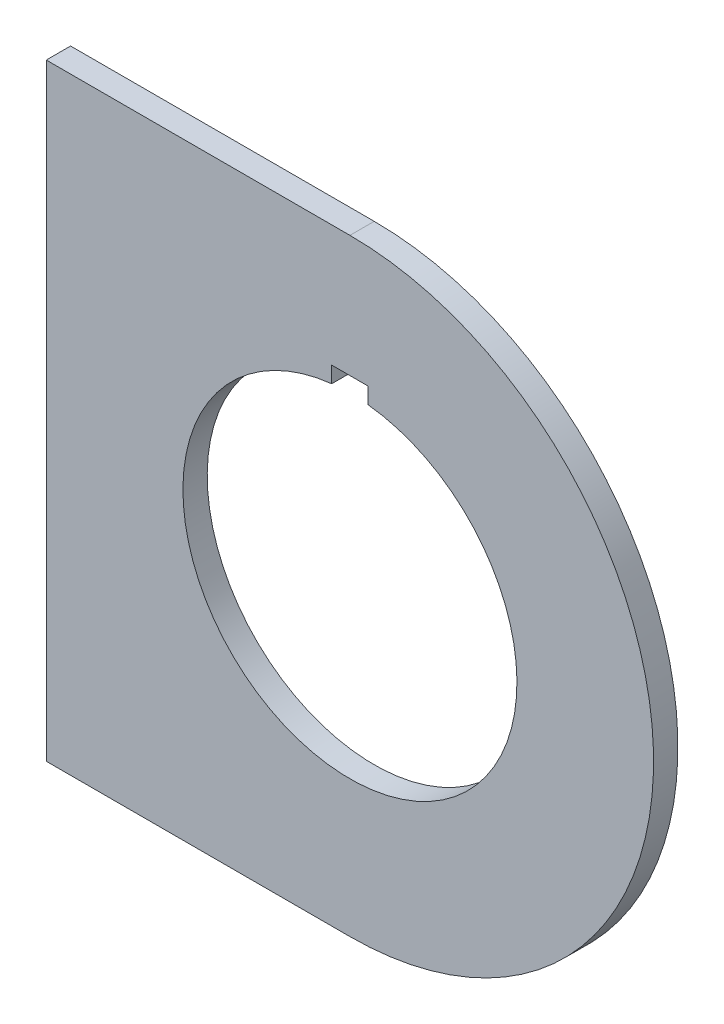
ISO-10303-21;
HEADER;
FILE_DESCRIPTION(('STEP AP214'),'2;1');
FILE_NAME('part.step','',(''),(''),'','','');
FILE_SCHEMA(('AUTOMOTIVE_DESIGN { 1 0 10303 214 1 1 1 1 }'));
ENDSEC;
DATA;
#1=APPLICATION_CONTEXT('core data for automotive mechanical design processes');
#2=APPLICATION_PROTOCOL_DEFINITION('international standard','automotive_design',2000,#1);
#3=PRODUCT_CONTEXT('',#1,'mechanical');
#4=PRODUCT('Part','Part','',(#3));
#5=PRODUCT_RELATED_PRODUCT_CATEGORY('part','',(#4));
#6=PRODUCT_DEFINITION_FORMATION('','',#4);
#7=PRODUCT_DEFINITION_CONTEXT('part definition',#1,'design');
#8=PRODUCT_DEFINITION('design','',#6,#7);
#9=PRODUCT_DEFINITION_SHAPE('','',#8);
#10=(LENGTH_UNIT() NAMED_UNIT(*) SI_UNIT(.MILLI.,.METRE.));
#11=(NAMED_UNIT(*) PLANE_ANGLE_UNIT() SI_UNIT($,.RADIAN.));
#12=(NAMED_UNIT(*) SI_UNIT($,.STERADIAN.) SOLID_ANGLE_UNIT());
#13=UNCERTAINTY_MEASURE_WITH_UNIT(LENGTH_MEASURE(1.E-05),#10,'distance_accuracy_value','');
#14=(GEOMETRIC_REPRESENTATION_CONTEXT(3) GLOBAL_UNCERTAINTY_ASSIGNED_CONTEXT((#13)) GLOBAL_UNIT_ASSIGNED_CONTEXT((#10,
#11,#12)) REPRESENTATION_CONTEXT('',''));
#15=CARTESIAN_POINT('',(0.,0.,0.));
#16=DIRECTION('',(0.,0.,1.));
#17=DIRECTION('',(1.,0.,0.));
#18=AXIS2_PLACEMENT_3D('',#15,#16,#17);
#19=CARTESIAN_POINT('',(25.,25.,2.));
#20=DIRECTION('',(0.,0.,1.));
#21=DIRECTION('',(1.,0.,0.));
#22=AXIS2_PLACEMENT_3D('',#19,#20,#21);
#23=PLANE('',#22);
#24=DIRECTION('',(0.,-1.,0.));
#25=VECTOR('',#24,1.);
#26=CARTESIAN_POINT('',(0.,0.,2.));
#27=LINE('',#26,#25);
#28=CARTESIAN_POINT('',(0.,50.,2.));
#29=VERTEX_POINT('',#28);
#30=CARTESIAN_POINT('',(0.,0.,2.));
#31=VERTEX_POINT('',#30);
#32=EDGE_CURVE('E136',#29,#31,#27,.T.);
#33=ORIENTED_EDGE('',*,*,#32,.T.);
#34=DIRECTION('',(1.,0.,0.));
#35=VECTOR('',#34,1.);
#36=CARTESIAN_POINT('',(0.,0.,2.));
#37=LINE('',#36,#35);
#38=CARTESIAN_POINT('',(25.,0.,2.));
#39=VERTEX_POINT('',#38);
#40=EDGE_CURVE('E139',#31,#39,#37,.T.);
#41=ORIENTED_EDGE('',*,*,#40,.T.);
#42=CARTESIAN_POINT('',(25.,25.,2.));
#43=DIRECTION('',(0.,0.,1.));
#44=DIRECTION('',(1.,0.,0.));
#45=AXIS2_PLACEMENT_3D('',#42,#43,#44);
#46=CIRCLE('',#45,25.);
#47=CARTESIAN_POINT('',(25.,50.,2.));
#48=VERTEX_POINT('',#47);
#49=EDGE_CURVE('E142',#39,#48,#46,.T.);
#50=ORIENTED_EDGE('',*,*,#49,.T.);
#51=DIRECTION('',(-1.,0.,0.));
#52=VECTOR('',#51,1.);
#53=CARTESIAN_POINT('',(0.,50.,2.));
#54=LINE('',#53,#52);
#55=EDGE_CURVE('E144',#48,#29,#54,.T.);
#56=ORIENTED_EDGE('',*,*,#55,.T.);
#57=EDGE_LOOP('',(#33,#41,#50,#56));
#58=FACE_BOUND('',#57,.T.);
#59=DIRECTION('',(0.,1.,0.));
#60=VECTOR('',#59,1.);
#61=CARTESIAN_POINT('',(26.5,40.,2.));
#62=LINE('',#61,#60);
#63=CARTESIAN_POINT('',(26.5,38.6679369328366,2.));
#64=VERTEX_POINT('',#63);
#65=CARTESIAN_POINT('',(26.5,40.,2.));
#66=VERTEX_POINT('',#65);
#67=EDGE_CURVE('E108',#64,#66,#62,.T.);
#68=ORIENTED_EDGE('',*,*,#67,.F.);
#69=CARTESIAN_POINT('',(25.,25.,2.));
#70=DIRECTION('',(0.,0.,1.));
#71=DIRECTION('',(1.,0.,0.));
#72=AXIS2_PLACEMENT_3D('',#69,#70,#71);
#73=CIRCLE('',#72,13.75);
#74=CARTESIAN_POINT('',(23.5,38.6679369328366,2.));
#75=VERTEX_POINT('',#74);
#76=EDGE_CURVE('E100',#75,#64,#73,.T.);
#77=ORIENTED_EDGE('',*,*,#76,.F.);
#78=DIRECTION('',(0.,-1.,0.));
#79=VECTOR('',#78,1.);
#80=CARTESIAN_POINT('',(23.5,40.,2.));
#81=LINE('',#80,#79);
#82=CARTESIAN_POINT('',(23.5,40.,2.));
#83=VERTEX_POINT('',#82);
#84=EDGE_CURVE('E122',#83,#75,#81,.T.);
#85=ORIENTED_EDGE('',*,*,#84,.F.);
#86=DIRECTION('',(-1.,0.,0.));
#87=VECTOR('',#86,1.);
#88=CARTESIAN_POINT('',(23.5,40.,2.));
#89=LINE('',#88,#87);
#90=EDGE_CURVE('E120',#66,#83,#89,.T.);
#91=ORIENTED_EDGE('',*,*,#90,.F.);
#92=EDGE_LOOP('',(#68,#77,#85,#91));
#93=FACE_BOUND('',#92,.T.);
#94=ADVANCED_FACE('F35',(#58,#93),#23,.T.);
#95=CARTESIAN_POINT('',(25.,25.,0.));
#96=DIRECTION('',(0.,0.,1.));
#97=DIRECTION('',(1.,0.,0.));
#98=AXIS2_PLACEMENT_3D('',#95,#96,#97);
#99=PLANE('',#98);
#100=DIRECTION('',(0.,-1.,0.));
#101=VECTOR('',#100,1.);
#102=CARTESIAN_POINT('',(0.,0.,0.));
#103=LINE('',#102,#101);
#104=CARTESIAN_POINT('',(0.,50.,0.));
#105=VERTEX_POINT('',#104);
#106=CARTESIAN_POINT('',(0.,0.,0.));
#107=VERTEX_POINT('',#106);
#108=EDGE_CURVE('E116',#105,#107,#103,.T.);
#109=ORIENTED_EDGE('',*,*,#108,.F.);
#110=DIRECTION('',(-1.,0.,0.));
#111=VECTOR('',#110,1.);
#112=CARTESIAN_POINT('',(0.,50.,0.));
#113=LINE('',#112,#111);
#114=CARTESIAN_POINT('',(25.,50.,0.));
#115=VERTEX_POINT('',#114);
#116=EDGE_CURVE('E140',#115,#105,#113,.T.);
#117=ORIENTED_EDGE('',*,*,#116,.F.);
#118=CARTESIAN_POINT('',(25.,25.,0.));
#119=DIRECTION('',(0.,0.,1.));
#120=DIRECTION('',(1.,0.,0.));
#121=AXIS2_PLACEMENT_3D('',#118,#119,#120);
#122=CIRCLE('',#121,25.);
#123=CARTESIAN_POINT('',(25.,0.,0.));
#124=VERTEX_POINT('',#123);
#125=EDGE_CURVE('E151',#124,#115,#122,.T.);
#126=ORIENTED_EDGE('',*,*,#125,.F.);
#127=DIRECTION('',(1.,0.,0.));
#128=VECTOR('',#127,1.);
#129=CARTESIAN_POINT('',(0.,0.,0.));
#130=LINE('',#129,#128);
#131=EDGE_CURVE('E149',#107,#124,#130,.T.);
#132=ORIENTED_EDGE('',*,*,#131,.F.);
#133=EDGE_LOOP('',(#109,#117,#126,#132));
#134=FACE_BOUND('',#133,.T.);
#135=CARTESIAN_POINT('',(25.,25.,0.));
#136=DIRECTION('',(0.,0.,1.));
#137=DIRECTION('',(1.,0.,0.));
#138=AXIS2_PLACEMENT_3D('',#135,#136,#137);
#139=CIRCLE('',#138,13.75);
#140=CARTESIAN_POINT('',(23.5,38.6679369328366,0.));
#141=VERTEX_POINT('',#140);
#142=CARTESIAN_POINT('',(26.5,38.6679369328366,0.));
#143=VERTEX_POINT('',#142);
#144=EDGE_CURVE('E58',#141,#143,#139,.T.);
#145=ORIENTED_EDGE('',*,*,#144,.T.);
#146=DIRECTION('',(0.,1.,0.));
#147=VECTOR('',#146,1.);
#148=CARTESIAN_POINT('',(26.5,40.,0.));
#149=LINE('',#148,#147);
#150=CARTESIAN_POINT('',(26.5,40.,0.));
#151=VERTEX_POINT('',#150);
#152=EDGE_CURVE('E115',#143,#151,#149,.T.);
#153=ORIENTED_EDGE('',*,*,#152,.T.);
#154=DIRECTION('',(-1.,0.,0.));
#155=VECTOR('',#154,1.);
#156=CARTESIAN_POINT('',(23.5,40.,0.));
#157=LINE('',#156,#155);
#158=CARTESIAN_POINT('',(23.5,40.,0.));
#159=VERTEX_POINT('',#158);
#160=EDGE_CURVE('E128',#151,#159,#157,.T.);
#161=ORIENTED_EDGE('',*,*,#160,.T.);
#162=DIRECTION('',(0.,-1.,0.));
#163=VECTOR('',#162,1.);
#164=CARTESIAN_POINT('',(23.5,40.,0.));
#165=LINE('',#164,#163);
#166=EDGE_CURVE('E109',#159,#141,#165,.T.);
#167=ORIENTED_EDGE('',*,*,#166,.T.);
#168=EDGE_LOOP('',(#145,#153,#161,#167));
#169=FACE_BOUND('',#168,.T.);
#170=ADVANCED_FACE('F169',(#134,#169),#99,.F.);
#171=CARTESIAN_POINT('',(0.,0.,2.));
#172=DIRECTION('',(1.,0.,0.));
#173=DIRECTION('',(0.,0.,-1.));
#174=AXIS2_PLACEMENT_3D('',#171,#172,#173);
#175=PLANE('',#174);
#176=ORIENTED_EDGE('',*,*,#108,.T.);
#177=DIRECTION('',(0.,0.,-1.));
#178=VECTOR('',#177,1.);
#179=CARTESIAN_POINT('',(0.,0.,2.));
#180=LINE('',#179,#178);
#181=EDGE_CURVE('E11',#31,#107,#180,.T.);
#182=ORIENTED_EDGE('',*,*,#181,.F.);
#183=ORIENTED_EDGE('',*,*,#32,.F.);
#184=DIRECTION('',(0.,0.,-1.));
#185=VECTOR('',#184,1.);
#186=CARTESIAN_POINT('',(0.,50.,2.));
#187=LINE('',#186,#185);
#188=EDGE_CURVE('E146',#29,#105,#187,.T.);
#189=ORIENTED_EDGE('',*,*,#188,.T.);
#190=EDGE_LOOP('',(#176,#182,#183,#189));
#191=FACE_BOUND('',#190,.T.);
#192=ADVANCED_FACE('F37',(#191),#175,.F.);
#193=CARTESIAN_POINT('',(0.,0.,2.));
#194=DIRECTION('',(0.,1.,0.));
#195=DIRECTION('',(0.,0.,1.));
#196=AXIS2_PLACEMENT_3D('',#193,#194,#195);
#197=PLANE('',#196);
#198=ORIENTED_EDGE('',*,*,#131,.T.);
#199=DIRECTION('',(0.,0.,-1.));
#200=VECTOR('',#199,1.);
#201=CARTESIAN_POINT('',(25.,0.,2.));
#202=LINE('',#201,#200);
#203=EDGE_CURVE('E43',#39,#124,#202,.T.);
#204=ORIENTED_EDGE('',*,*,#203,.F.);
#205=ORIENTED_EDGE('',*,*,#40,.F.);
#206=ORIENTED_EDGE('',*,*,#181,.T.);
#207=EDGE_LOOP('',(#198,#204,#205,#206));
#208=FACE_BOUND('',#207,.T.);
#209=ADVANCED_FACE('F179',(#208),#197,.F.);
#210=CARTESIAN_POINT('',(25.,25.,2.));
#211=DIRECTION('',(0.,0.,-1.));
#212=DIRECTION('',(-1.,0.,0.));
#213=AXIS2_PLACEMENT_3D('',#210,#211,#212);
#214=CYLINDRICAL_SURFACE('',#213,25.);
#215=ORIENTED_EDGE('',*,*,#125,.T.);
#216=DIRECTION('',(0.,0.,-1.));
#217=VECTOR('',#216,1.);
#218=CARTESIAN_POINT('',(25.,50.,2.));
#219=LINE('',#218,#217);
#220=EDGE_CURVE('E156',#48,#115,#219,.T.);
#221=ORIENTED_EDGE('',*,*,#220,.F.);
#222=ORIENTED_EDGE('',*,*,#49,.F.);
#223=ORIENTED_EDGE('',*,*,#203,.T.);
#224=EDGE_LOOP('',(#215,#221,#222,#223));
#225=FACE_BOUND('',#224,.T.);
#226=ADVANCED_FACE('F163',(#225),#214,.T.);
#227=CARTESIAN_POINT('',(0.,50.,2.));
#228=DIRECTION('',(0.,-1.,0.));
#229=DIRECTION('',(0.,0.,-1.));
#230=AXIS2_PLACEMENT_3D('',#227,#228,#229);
#231=PLANE('',#230);
#232=ORIENTED_EDGE('',*,*,#116,.T.);
#233=ORIENTED_EDGE('',*,*,#188,.F.);
#234=ORIENTED_EDGE('',*,*,#55,.F.);
#235=ORIENTED_EDGE('',*,*,#220,.T.);
#236=EDGE_LOOP('',(#232,#233,#234,#235));
#237=FACE_BOUND('',#236,.T.);
#238=ADVANCED_FACE('F173',(#237),#231,.F.);
#239=CARTESIAN_POINT('',(25.,25.,2.));
#240=DIRECTION('',(0.,0.,-1.));
#241=DIRECTION('',(-1.,0.,0.));
#242=AXIS2_PLACEMENT_3D('',#239,#240,#241);
#243=CYLINDRICAL_SURFACE('',#242,13.75);
#244=ORIENTED_EDGE('',*,*,#144,.F.);
#245=DIRECTION('',(0.,0.,-1.));
#246=VECTOR('',#245,1.);
#247=CARTESIAN_POINT('',(23.5,38.6679369328366,2.));
#248=LINE('',#247,#246);
#249=EDGE_CURVE('E104',#75,#141,#248,.T.);
#250=ORIENTED_EDGE('',*,*,#249,.F.);
#251=ORIENTED_EDGE('',*,*,#76,.T.);
#252=DIRECTION('',(0.,0.,-1.));
#253=VECTOR('',#252,1.);
#254=CARTESIAN_POINT('',(26.5,38.6679369328366,2.));
#255=LINE('',#254,#253);
#256=EDGE_CURVE('E103',#64,#143,#255,.T.);
#257=ORIENTED_EDGE('',*,*,#256,.T.);
#258=EDGE_LOOP('',(#244,#250,#251,#257));
#259=FACE_BOUND('',#258,.T.);
#260=ADVANCED_FACE('F102',(#259),#243,.F.);
#261=CARTESIAN_POINT('',(26.5,40.,2.));
#262=DIRECTION('',(-1.,0.,0.));
#263=DIRECTION('',(0.,0.,1.));
#264=AXIS2_PLACEMENT_3D('',#261,#262,#263);
#265=PLANE('',#264);
#266=ORIENTED_EDGE('',*,*,#152,.F.);
#267=ORIENTED_EDGE('',*,*,#256,.F.);
#268=ORIENTED_EDGE('',*,*,#67,.T.);
#269=DIRECTION('',(0.,0.,-1.));
#270=VECTOR('',#269,1.);
#271=CARTESIAN_POINT('',(26.5,40.,2.));
#272=LINE('',#271,#270);
#273=EDGE_CURVE('E117',#66,#151,#272,.T.);
#274=ORIENTED_EDGE('',*,*,#273,.T.);
#275=EDGE_LOOP('',(#266,#267,#268,#274));
#276=FACE_BOUND('',#275,.T.);
#277=ADVANCED_FACE('F112',(#276),#265,.T.);
#278=CARTESIAN_POINT('',(23.5,40.,2.));
#279=DIRECTION('',(0.,-1.,0.));
#280=DIRECTION('',(0.,0.,-1.));
#281=AXIS2_PLACEMENT_3D('',#278,#279,#280);
#282=PLANE('',#281);
#283=ORIENTED_EDGE('',*,*,#160,.F.);
#284=ORIENTED_EDGE('',*,*,#273,.F.);
#285=ORIENTED_EDGE('',*,*,#90,.T.);
#286=DIRECTION('',(0.,0.,-1.));
#287=VECTOR('',#286,1.);
#288=CARTESIAN_POINT('',(23.5,40.,2.));
#289=LINE('',#288,#287);
#290=EDGE_CURVE('E50',#83,#159,#289,.T.);
#291=ORIENTED_EDGE('',*,*,#290,.T.);
#292=EDGE_LOOP('',(#283,#284,#285,#291));
#293=FACE_BOUND('',#292,.T.);
#294=ADVANCED_FACE('F202',(#293),#282,.T.);
#295=CARTESIAN_POINT('',(23.5,40.,2.));
#296=DIRECTION('',(1.,0.,0.));
#297=DIRECTION('',(0.,0.,-1.));
#298=AXIS2_PLACEMENT_3D('',#295,#296,#297);
#299=PLANE('',#298);
#300=ORIENTED_EDGE('',*,*,#166,.F.);
#301=ORIENTED_EDGE('',*,*,#290,.F.);
#302=ORIENTED_EDGE('',*,*,#84,.T.);
#303=ORIENTED_EDGE('',*,*,#249,.T.);
#304=EDGE_LOOP('',(#300,#301,#302,#303));
#305=FACE_BOUND('',#304,.T.);
#306=ADVANCED_FACE('F206',(#305),#299,.T.);
#307=CLOSED_SHELL('',(#94,#170,#192,#209,#226,#238,#260,#277,#294,#306));
#308=MANIFOLD_SOLID_BREP('B2',#307);
#309=ADVANCED_BREP_SHAPE_REPRESENTATION('',(#18,#308),#14);
#310=SHAPE_DEFINITION_REPRESENTATION(#9,#309);
ENDSEC;
END-ISO-10303-21;
